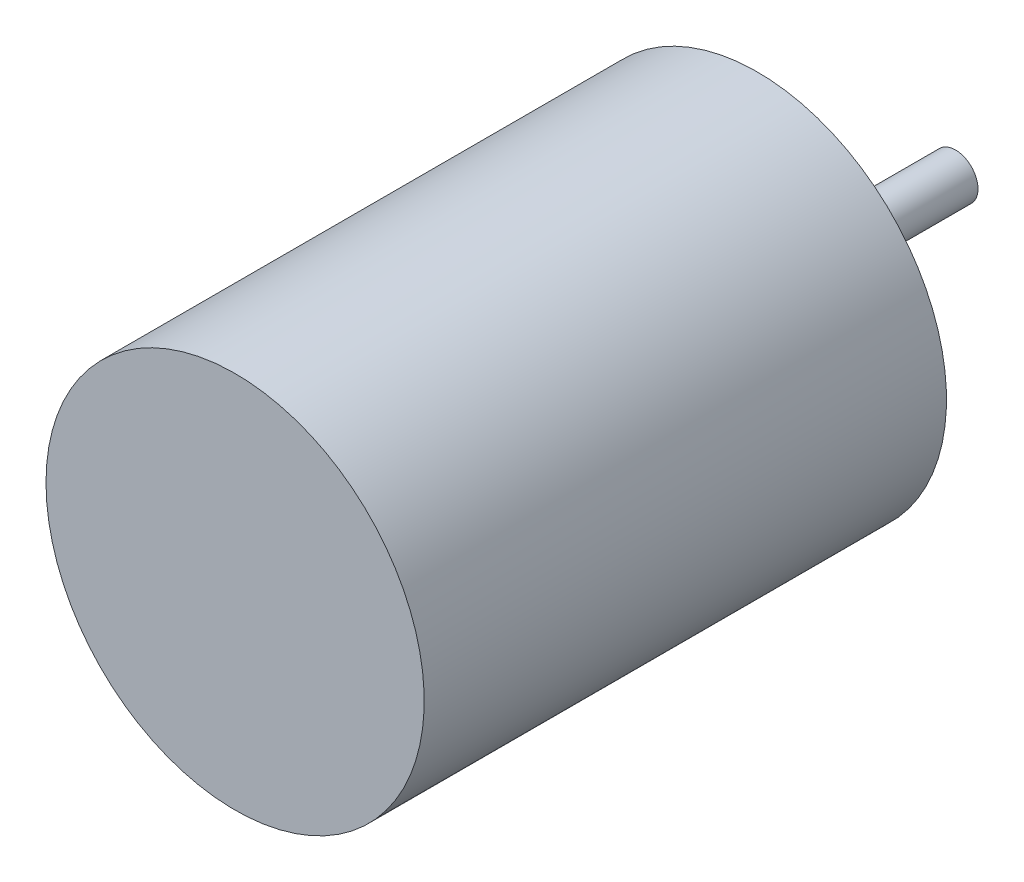
ISO-10303-21;
HEADER;
FILE_DESCRIPTION(('STEP AP214'),'2;1');
FILE_NAME('part.step','',(''),(''),'','','');
FILE_SCHEMA(('AUTOMOTIVE_DESIGN { 1 0 10303 214 1 1 1 1 }'));
ENDSEC;
DATA;
#1=APPLICATION_CONTEXT('core data for automotive mechanical design processes');
#2=APPLICATION_PROTOCOL_DEFINITION('international standard','automotive_design',2000,#1);
#3=PRODUCT_CONTEXT('',#1,'mechanical');
#4=PRODUCT('Part','Part','',(#3));
#5=PRODUCT_RELATED_PRODUCT_CATEGORY('part','',(#4));
#6=PRODUCT_DEFINITION_FORMATION('','',#4);
#7=PRODUCT_DEFINITION_CONTEXT('part definition',#1,'design');
#8=PRODUCT_DEFINITION('design','',#6,#7);
#9=PRODUCT_DEFINITION_SHAPE('','',#8);
#10=(LENGTH_UNIT() NAMED_UNIT(*) SI_UNIT(.MILLI.,.METRE.));
#11=(NAMED_UNIT(*) PLANE_ANGLE_UNIT() SI_UNIT($,.RADIAN.));
#12=(NAMED_UNIT(*) SI_UNIT($,.STERADIAN.) SOLID_ANGLE_UNIT());
#13=UNCERTAINTY_MEASURE_WITH_UNIT(LENGTH_MEASURE(1.E-05),#10,'distance_accuracy_value','');
#14=(GEOMETRIC_REPRESENTATION_CONTEXT(3) GLOBAL_UNCERTAINTY_ASSIGNED_CONTEXT((#13)) GLOBAL_UNIT_ASSIGNED_CONTEXT((#10,
#11,#12)) REPRESENTATION_CONTEXT('',''));
#15=CARTESIAN_POINT('',(0.,0.,0.));
#16=DIRECTION('',(0.,0.,1.));
#17=DIRECTION('',(1.,0.,0.));
#18=AXIS2_PLACEMENT_3D('',#15,#16,#17);
#19=CARTESIAN_POINT('',(75.7710063810863,-68.5826651294381,0.));
#20=DIRECTION('',(0.,0.,1.));
#21=DIRECTION('',(1.,0.,0.));
#22=AXIS2_PLACEMENT_3D('',#19,#20,#21);
#23=PLANE('',#22);
#24=CARTESIAN_POINT('',(75.7710063810863,-68.5826651294381,0.));
#25=DIRECTION('',(0.,0.,1.));
#26=DIRECTION('',(1.,0.,0.));
#27=AXIS2_PLACEMENT_3D('',#24,#25,#26);
#28=CIRCLE('',#27,21.);
#29=CARTESIAN_POINT('',(54.7710063810863,-68.5826651294381,0.));
#30=VERTEX_POINT('',#29);
#31=EDGE_CURVE('E42',#30,#30,#28,.T.);
#32=ORIENTED_EDGE('',*,*,#31,.F.);
#33=EDGE_LOOP('',(#32));
#34=FACE_BOUND('',#33,.T.);
#35=CARTESIAN_POINT('',(75.7710063810863,-68.5826651294381,0.));
#36=DIRECTION('',(0.,0.,1.));
#37=DIRECTION('',(1.,0.,0.));
#38=AXIS2_PLACEMENT_3D('',#35,#36,#37);
#39=CIRCLE('',#38,2.5);
#40=CARTESIAN_POINT('',(78.2710063810863,-68.5826651294381,0.));
#41=VERTEX_POINT('',#40);
#42=EDGE_CURVE('E10',#41,#41,#39,.F.);
#43=ORIENTED_EDGE('',*,*,#42,.F.);
#44=EDGE_LOOP('',(#43));
#45=FACE_BOUND('',#44,.T.);
#46=ADVANCED_FACE('F31',(#34,#45),#23,.F.);
#47=CARTESIAN_POINT('',(75.7710063810863,-68.5826651294381,58.));
#48=DIRECTION('',(0.,0.,-1.));
#49=DIRECTION('',(-1.,0.,0.));
#50=AXIS2_PLACEMENT_3D('',#47,#48,#49);
#51=CYLINDRICAL_SURFACE('',#50,21.);
#52=CARTESIAN_POINT('',(75.7710063810863,-68.5826651294381,58.));
#53=DIRECTION('',(0.,0.,1.));
#54=DIRECTION('',(1.,0.,0.));
#55=AXIS2_PLACEMENT_3D('',#52,#53,#54);
#56=CIRCLE('',#55,21.);
#57=CARTESIAN_POINT('',(54.7710063810863,-68.5826651294381,58.));
#58=VERTEX_POINT('',#57);
#59=EDGE_CURVE('E38',#58,#58,#56,.T.);
#60=CARTESIAN_POINT('',(54.7710063810863,-68.5826651294381,58.));
#61=CARTESIAN_POINT('',(54.7710063810863,-68.5826651294381,57.3958333333333));
#62=CARTESIAN_POINT('',(54.7710063810863,-68.5826651294381,56.7916666666667));
#63=CARTESIAN_POINT('',(54.7710063810863,-68.5826651294381,55.5833333333333));
#64=CARTESIAN_POINT('',(54.7710063810863,-68.5826651294381,54.9791666666667));
#65=CARTESIAN_POINT('',(54.7710063810863,-68.5826651294381,53.7708333333333));
#66=CARTESIAN_POINT('',(54.7710063810863,-68.5826651294381,53.1666666666667));
#67=CARTESIAN_POINT('',(54.7710063810863,-68.5826651294381,51.9583333333333));
#68=CARTESIAN_POINT('',(54.7710063810863,-68.5826651294381,51.3541666666667));
#69=CARTESIAN_POINT('',(54.7710063810863,-68.5826651294381,50.1458333333333));
#70=CARTESIAN_POINT('',(54.7710063810863,-68.5826651294381,49.5416666666667));
#71=CARTESIAN_POINT('',(54.7710063810863,-68.5826651294381,48.3333333333333));
#72=CARTESIAN_POINT('',(54.7710063810863,-68.5826651294381,47.7291666666667));
#73=CARTESIAN_POINT('',(54.7710063810863,-68.5826651294381,46.5208333333333));
#74=CARTESIAN_POINT('',(54.7710063810863,-68.5826651294381,45.9166666666667));
#75=CARTESIAN_POINT('',(54.7710063810863,-68.5826651294381,44.7083333333333));
#76=CARTESIAN_POINT('',(54.7710063810863,-68.5826651294381,44.1041666666667));
#77=CARTESIAN_POINT('',(54.7710063810863,-68.5826651294381,42.8958333333333));
#78=CARTESIAN_POINT('',(54.7710063810863,-68.5826651294381,42.2916666666667));
#79=CARTESIAN_POINT('',(54.7710063810863,-68.5826651294381,41.0833333333333));
#80=CARTESIAN_POINT('',(54.7710063810863,-68.5826651294381,40.4791666666667));
#81=CARTESIAN_POINT('',(54.7710063810863,-68.5826651294381,39.2708333333333));
#82=CARTESIAN_POINT('',(54.7710063810863,-68.5826651294381,38.6666666666667));
#83=CARTESIAN_POINT('',(54.7710063810863,-68.5826651294381,37.4583333333333));
#84=CARTESIAN_POINT('',(54.7710063810863,-68.5826651294381,36.8541666666667));
#85=CARTESIAN_POINT('',(54.7710063810863,-68.5826651294381,35.6458333333333));
#86=CARTESIAN_POINT('',(54.7710063810863,-68.5826651294381,35.0416666666667));
#87=CARTESIAN_POINT('',(54.7710063810863,-68.5826651294381,33.8333333333333));
#88=CARTESIAN_POINT('',(54.7710063810863,-68.5826651294381,33.2291666666667));
#89=CARTESIAN_POINT('',(54.7710063810863,-68.5826651294381,32.0208333333333));
#90=CARTESIAN_POINT('',(54.7710063810863,-68.5826651294381,31.4166666666667));
#91=CARTESIAN_POINT('',(54.7710063810863,-68.5826651294381,30.2083333333333));
#92=CARTESIAN_POINT('',(54.7710063810863,-68.5826651294381,29.6041666666667));
#93=CARTESIAN_POINT('',(54.7710063810863,-68.5826651294381,28.3958333333333));
#94=CARTESIAN_POINT('',(54.7710063810863,-68.5826651294381,27.7916666666667));
#95=CARTESIAN_POINT('',(54.7710063810863,-68.5826651294381,26.5833333333333));
#96=CARTESIAN_POINT('',(54.7710063810863,-68.5826651294381,25.9791666666667));
#97=CARTESIAN_POINT('',(54.7710063810863,-68.5826651294381,24.7708333333333));
#98=CARTESIAN_POINT('',(54.7710063810863,-68.5826651294381,24.1666666666667));
#99=CARTESIAN_POINT('',(54.7710063810863,-68.5826651294381,22.9583333333333));
#100=CARTESIAN_POINT('',(54.7710063810863,-68.5826651294381,22.3541666666667));
#101=CARTESIAN_POINT('',(54.7710063810863,-68.5826651294381,21.1458333333333));
#102=CARTESIAN_POINT('',(54.7710063810863,-68.5826651294381,20.5416666666667));
#103=CARTESIAN_POINT('',(54.7710063810863,-68.5826651294381,19.3333333333333));
#104=CARTESIAN_POINT('',(54.7710063810863,-68.5826651294381,18.7291666666667));
#105=CARTESIAN_POINT('',(54.7710063810863,-68.5826651294381,17.5208333333333));
#106=CARTESIAN_POINT('',(54.7710063810863,-68.5826651294381,16.9166666666667));
#107=CARTESIAN_POINT('',(54.7710063810863,-68.5826651294381,15.7083333333333));
#108=CARTESIAN_POINT('',(54.7710063810863,-68.5826651294381,15.1041666666667));
#109=CARTESIAN_POINT('',(54.7710063810863,-68.5826651294381,13.8958333333333));
#110=CARTESIAN_POINT('',(54.7710063810863,-68.5826651294381,13.2916666666667));
#111=CARTESIAN_POINT('',(54.7710063810863,-68.5826651294381,12.0833333333333));
#112=CARTESIAN_POINT('',(54.7710063810863,-68.5826651294381,11.4791666666667));
#113=CARTESIAN_POINT('',(54.7710063810863,-68.5826651294381,10.2708333333333));
#114=CARTESIAN_POINT('',(54.7710063810863,-68.5826651294381,9.66666666666667));
#115=CARTESIAN_POINT('',(54.7710063810863,-68.5826651294381,8.45833333333333));
#116=CARTESIAN_POINT('',(54.7710063810863,-68.5826651294381,7.85416666666667));
#117=CARTESIAN_POINT('',(54.7710063810863,-68.5826651294381,6.64583333333333));
#118=CARTESIAN_POINT('',(54.7710063810863,-68.5826651294381,6.04166666666667));
#119=CARTESIAN_POINT('',(54.7710063810863,-68.5826651294381,4.83333333333333));
#120=CARTESIAN_POINT('',(54.7710063810863,-68.5826651294381,4.22916666666667));
#121=CARTESIAN_POINT('',(54.7710063810863,-68.5826651294381,3.02083333333334));
#122=CARTESIAN_POINT('',(54.7710063810863,-68.5826651294381,2.41666666666667));
#123=CARTESIAN_POINT('',(54.7710063810863,-68.5826651294381,1.20833333333333));
#124=CARTESIAN_POINT('',(54.7710063810863,-68.5826651294381,0.604166666666666));
#125=CARTESIAN_POINT('',(54.7710063810863,-68.5826651294381,0.));
#126=B_SPLINE_CURVE_WITH_KNOTS('',3,(#60,#61,#62,#63,#64,#65,#66,#67,#68,#69,#70,#71,#72,#73,
#74,#75,#76,#77,#78,#79,#80,#81,#82,#83,#84,#85,#86,#87,#88,#89,#90,#91,#92,#93,#94,#95,#96,#97,
#98,#99,#100,#101,#102,#103,#104,#105,#106,#107,#108,#109,#110,#111,#112,#113,#114,#115,#116,
#117,#118,#119,#120,#121,#122,#123,#124,#125),.UNSPECIFIED.,.F.,.F.,(4,2,2,2,2,2,2,2,2,2,2,2,2,
2,2,2,2,2,2,2,2,2,2,2,2,2,2,2,2,2,2,2,4),(0.,1.81249999999999,3.625,5.4375,7.24999999999999,
9.06249999999999,10.875,12.6875,14.5,16.3125,18.125,19.9375,21.75,23.5625,25.375,27.1875,29.,
30.8125,32.625,34.4375,36.25,38.0625,39.875,41.6875,43.5,45.3125,47.125,48.9375,50.75,52.5625,
54.375,56.1875,58.),.UNSPECIFIED.);
#127=EDGE_CURVE('BSEAM33',#58,#30,#126,.T.);
#128=ORIENTED_EDGE('',*,*,#59,.F.);
#129=ORIENTED_EDGE('',*,*,#31,.T.);
#130=ORIENTED_EDGE('',*,*,#127,.T.);
#131=ORIENTED_EDGE('',*,*,#127,.F.);
#132=EDGE_LOOP('',(#128,#130,#129,#131));
#133=FACE_BOUND('',#132,.T.);
#134=ADVANCED_FACE('F33',(#133),#51,.T.);
#135=CARTESIAN_POINT('',(75.7710063810863,-68.5826651294381,58.));
#136=DIRECTION('',(0.,0.,1.));
#137=DIRECTION('',(1.,0.,0.));
#138=AXIS2_PLACEMENT_3D('',#135,#136,#137);
#139=PLANE('',#138);
#140=ORIENTED_EDGE('',*,*,#59,.T.);
#141=EDGE_LOOP('',(#140));
#142=FACE_BOUND('',#141,.T.);
#143=ADVANCED_FACE('F56',(#142),#139,.T.);
#144=CARTESIAN_POINT('',(75.7710063810863,-68.5826651294381,-22.));
#145=DIRECTION('',(0.,0.,1.));
#146=DIRECTION('',(1.,0.,0.));
#147=AXIS2_PLACEMENT_3D('',#144,#145,#146);
#148=CYLINDRICAL_SURFACE('',#147,2.5);
#149=CARTESIAN_POINT('',(75.7710063810863,-68.5826651294381,-22.));
#150=DIRECTION('',(0.,0.,-1.));
#151=DIRECTION('',(-1.,0.,0.));
#152=AXIS2_PLACEMENT_3D('',#149,#150,#151);
#153=CIRCLE('',#152,2.5);
#154=CARTESIAN_POINT('',(73.2710063810863,-68.5826651294381,-22.));
#155=VERTEX_POINT('',#154);
#156=EDGE_CURVE('E47',#155,#155,#153,.T.);
#157=ORIENTED_EDGE('',*,*,#156,.F.);
#158=EDGE_LOOP('',(#157));
#159=FACE_BOUND('',#158,.T.);
#160=ORIENTED_EDGE('',*,*,#42,.T.);
#161=EDGE_LOOP('',(#160));
#162=FACE_BOUND('',#161,.T.);
#163=ADVANCED_FACE('F54',(#159,#162),#148,.T.);
#164=CARTESIAN_POINT('',(75.7710063810863,-68.5826651294381,-22.));
#165=DIRECTION('',(0.,0.,-1.));
#166=DIRECTION('',(-1.,0.,0.));
#167=AXIS2_PLACEMENT_3D('',#164,#165,#166);
#168=PLANE('',#167);
#169=ORIENTED_EDGE('',*,*,#156,.T.);
#170=EDGE_LOOP('',(#169));
#171=FACE_BOUND('',#170,.T.);
#172=ADVANCED_FACE('F52',(#171),#168,.T.);
#173=CLOSED_SHELL('',(#46,#134,#143,#163,#172));
#174=MANIFOLD_SOLID_BREP('B2',#173);
#175=ADVANCED_BREP_SHAPE_REPRESENTATION('',(#18,#174),#14);
#176=SHAPE_DEFINITION_REPRESENTATION(#9,#175);
ENDSEC;
END-ISO-10303-21;
